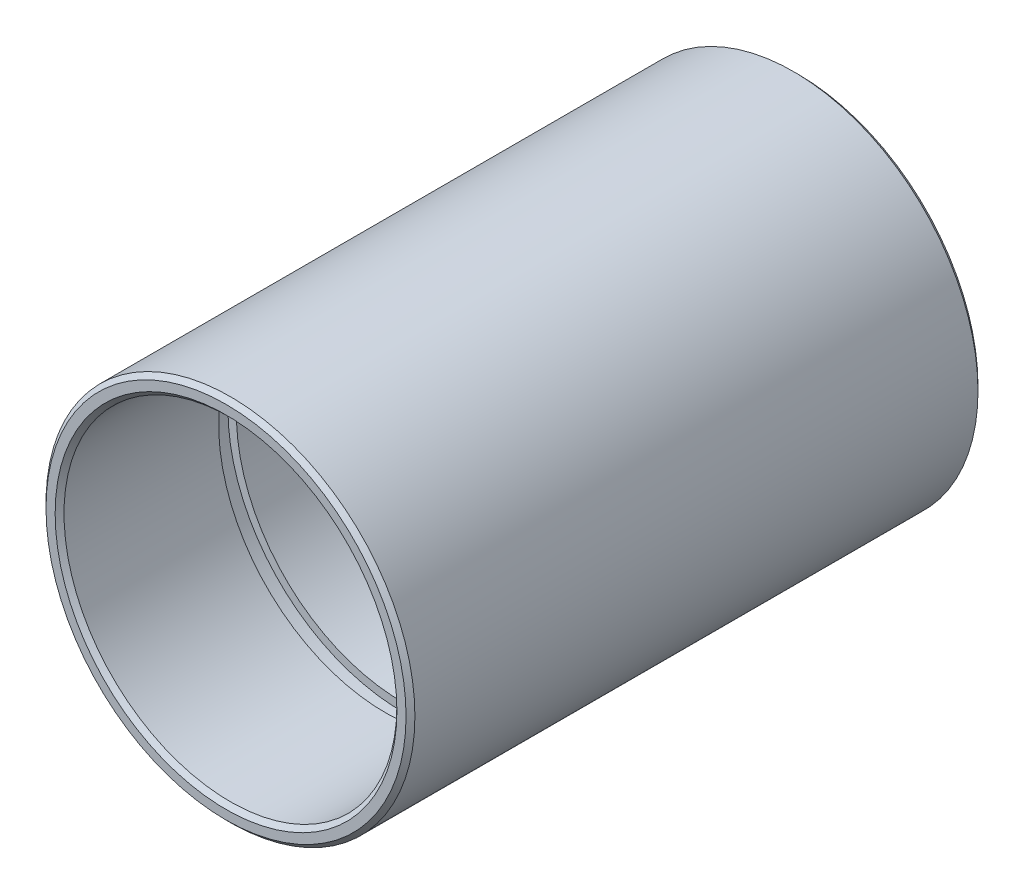
ISO-10303-21;
HEADER;
FILE_DESCRIPTION(('STEP AP214'),'2;1');
FILE_NAME('part.step','',(''),(''),'','','');
FILE_SCHEMA(('AUTOMOTIVE_DESIGN { 1 0 10303 214 1 1 1 1 }'));
ENDSEC;
DATA;
#1=APPLICATION_CONTEXT('core data for automotive mechanical design processes');
#2=APPLICATION_PROTOCOL_DEFINITION('international standard','automotive_design',2000,#1);
#3=PRODUCT_CONTEXT('',#1,'mechanical');
#4=PRODUCT('Part','Part','',(#3));
#5=PRODUCT_RELATED_PRODUCT_CATEGORY('part','',(#4));
#6=PRODUCT_DEFINITION_FORMATION('','',#4);
#7=PRODUCT_DEFINITION_CONTEXT('part definition',#1,'design');
#8=PRODUCT_DEFINITION('design','',#6,#7);
#9=PRODUCT_DEFINITION_SHAPE('','',#8);
#10=(LENGTH_UNIT() NAMED_UNIT(*) SI_UNIT(.MILLI.,.METRE.));
#11=(NAMED_UNIT(*) PLANE_ANGLE_UNIT() SI_UNIT($,.RADIAN.));
#12=(NAMED_UNIT(*) SI_UNIT($,.STERADIAN.) SOLID_ANGLE_UNIT());
#13=UNCERTAINTY_MEASURE_WITH_UNIT(LENGTH_MEASURE(1.E-05),#10,'distance_accuracy_value','');
#14=(GEOMETRIC_REPRESENTATION_CONTEXT(3) GLOBAL_UNCERTAINTY_ASSIGNED_CONTEXT((#13)) GLOBAL_UNIT_ASSIGNED_CONTEXT((#10,
#11,#12)) REPRESENTATION_CONTEXT('',''));
#15=CARTESIAN_POINT('',(0.,0.,0.));
#16=DIRECTION('',(0.,0.,1.));
#17=DIRECTION('',(1.,0.,0.));
#18=AXIS2_PLACEMENT_3D('',#15,#16,#17);
#19=CARTESIAN_POINT('',(0.,0.,49.2252));
#20=DIRECTION('',(0.,0.,-1.));
#21=DIRECTION('',(-1.,0.,0.));
#22=AXIS2_PLACEMENT_3D('',#19,#20,#21);
#23=CYLINDRICAL_SURFACE('',#22,14.3256);
#24=CARTESIAN_POINT('',(0.,0.,15.2146));
#25=DIRECTION('',(0.,0.,1.));
#26=DIRECTION('',(1.,0.,0.));
#27=AXIS2_PLACEMENT_3D('',#24,#25,#26);
#28=CIRCLE('',#27,14.3256);
#29=CARTESIAN_POINT('',(14.3256,0.,15.2146));
#30=VERTEX_POINT('',#29);
#31=EDGE_CURVE('E47',#30,#30,#28,.T.);
#32=ORIENTED_EDGE('',*,*,#31,.F.);
#33=EDGE_LOOP('',(#32));
#34=FACE_BOUND('',#33,.T.);
#35=CARTESIAN_POINT('',(0.,0.,34.0106));
#36=DIRECTION('',(0.,0.,1.));
#37=DIRECTION('',(1.,0.,0.));
#38=AXIS2_PLACEMENT_3D('',#35,#36,#37);
#39=CIRCLE('',#38,14.3256);
#40=CARTESIAN_POINT('',(14.3256,0.,34.0106));
#41=VERTEX_POINT('',#40);
#42=EDGE_CURVE('E54',#41,#41,#39,.T.);
#43=ORIENTED_EDGE('',*,*,#42,.T.);
#44=EDGE_LOOP('',(#43));
#45=FACE_BOUND('',#44,.T.);
#46=ADVANCED_FACE('F30',(#34,#45),#23,.F.);
#47=CARTESIAN_POINT('',(0.,0.,0.380999999999999));
#48=DIRECTION('',(0.,0.,1.));
#49=DIRECTION('',(1.,0.,0.));
#50=AXIS2_PLACEMENT_3D('',#47,#48,#49);
#51=CIRCLE('',#50,14.3256);
#52=CARTESIAN_POINT('',(14.3256,0.,0.380999999999999));
#53=VERTEX_POINT('',#52);
#54=EDGE_CURVE('E81',#53,#53,#51,.F.);
#55=ORIENTED_EDGE('',*,*,#54,.T.);
#56=EDGE_LOOP('',(#55));
#57=FACE_BOUND('',#56,.T.);
#58=CARTESIAN_POINT('',(0.,0.,13.6906));
#59=DIRECTION('',(0.,0.,1.));
#60=DIRECTION('',(1.,0.,0.));
#61=AXIS2_PLACEMENT_3D('',#58,#59,#60);
#62=CIRCLE('',#61,14.3256);
#63=CARTESIAN_POINT('',(14.3256,0.,13.6906));
#64=VERTEX_POINT('',#63);
#65=EDGE_CURVE('E50',#64,#64,#62,.T.);
#66=ORIENTED_EDGE('',*,*,#65,.T.);
#67=EDGE_LOOP('',(#66));
#68=FACE_BOUND('',#67,.T.);
#69=ADVANCED_FACE('F105',(#57,#68),#23,.F.);
#70=CARTESIAN_POINT('',(0.,0.,49.2252));
#71=DIRECTION('',(0.,0.,1.));
#72=DIRECTION('',(1.,0.,0.));
#73=AXIS2_PLACEMENT_3D('',#70,#71,#72);
#74=PLANE('',#73);
#75=CARTESIAN_POINT('',(0.,0.,49.2252));
#76=DIRECTION('',(0.,0.,1.));
#77=DIRECTION('',(1.,0.,0.));
#78=AXIS2_PLACEMENT_3D('',#75,#76,#77);
#79=CIRCLE('',#78,14.7066);
#80=CARTESIAN_POINT('',(14.7066,0.,49.2252));
#81=VERTEX_POINT('',#80);
#82=EDGE_CURVE('E43',#81,#81,#79,.F.);
#83=ORIENTED_EDGE('',*,*,#82,.T.);
#84=EDGE_LOOP('',(#83));
#85=FACE_BOUND('',#84,.T.);
#86=CARTESIAN_POINT('',(0.,0.,49.2252));
#87=DIRECTION('',(0.,0.,1.));
#88=DIRECTION('',(1.,0.,0.));
#89=AXIS2_PLACEMENT_3D('',#86,#87,#88);
#90=CIRCLE('',#89,15.494);
#91=CARTESIAN_POINT('',(15.494,0.,49.2252));
#92=VERTEX_POINT('',#91);
#93=EDGE_CURVE('E84',#92,#92,#90,.T.);
#94=ORIENTED_EDGE('',*,*,#93,.T.);
#95=EDGE_LOOP('',(#94));
#96=FACE_BOUND('',#95,.T.);
#97=ADVANCED_FACE('F89',(#85,#96),#74,.T.);
#98=CARTESIAN_POINT('',(0.,0.,0.));
#99=DIRECTION('',(0.,0.,1.));
#100=DIRECTION('',(1.,0.,0.));
#101=AXIS2_PLACEMENT_3D('',#98,#99,#100);
#102=PLANE('',#101);
#103=CARTESIAN_POINT('',(0.,0.,0.));
#104=DIRECTION('',(0.,0.,1.));
#105=DIRECTION('',(1.,0.,0.));
#106=AXIS2_PLACEMENT_3D('',#103,#104,#105);
#107=CIRCLE('',#106,14.7066);
#108=CARTESIAN_POINT('',(14.7066,0.,0.));
#109=VERTEX_POINT('',#108);
#110=EDGE_CURVE('E75',#109,#109,#107,.T.);
#111=ORIENTED_EDGE('',*,*,#110,.T.);
#112=EDGE_LOOP('',(#111));
#113=FACE_BOUND('',#112,.T.);
#114=CARTESIAN_POINT('',(0.,0.,0.));
#115=DIRECTION('',(0.,0.,1.));
#116=DIRECTION('',(1.,0.,0.));
#117=AXIS2_PLACEMENT_3D('',#114,#115,#116);
#118=CIRCLE('',#117,15.494);
#119=CARTESIAN_POINT('',(15.494,0.,0.));
#120=VERTEX_POINT('',#119);
#121=EDGE_CURVE('E53',#120,#120,#118,.F.);
#122=ORIENTED_EDGE('',*,*,#121,.T.);
#123=EDGE_LOOP('',(#122));
#124=FACE_BOUND('',#123,.T.);
#125=ADVANCED_FACE('F112',(#113,#124),#102,.F.);
#126=CARTESIAN_POINT('',(0.,0.,49.2252));
#127=DIRECTION('',(0.,0.,-1.));
#128=DIRECTION('',(-1.,0.,0.));
#129=AXIS2_PLACEMENT_3D('',#126,#127,#128);
#130=CYLINDRICAL_SURFACE('',#129,15.875);
#131=CARTESIAN_POINT('',(0.,0.,0.380999999999999));
#132=DIRECTION('',(0.,0.,1.));
#133=DIRECTION('',(1.,0.,0.));
#134=AXIS2_PLACEMENT_3D('',#131,#132,#133);
#135=CIRCLE('',#134,15.875);
#136=CARTESIAN_POINT('',(15.875,0.,0.380999999999999));
#137=VERTEX_POINT('',#136);
#138=EDGE_CURVE('E10',#137,#137,#135,.T.);
#139=ORIENTED_EDGE('',*,*,#138,.T.);
#140=EDGE_LOOP('',(#139));
#141=FACE_BOUND('',#140,.T.);
#142=CARTESIAN_POINT('',(0.,0.,48.8442));
#143=DIRECTION('',(0.,0.,1.));
#144=DIRECTION('',(1.,0.,0.));
#145=AXIS2_PLACEMENT_3D('',#142,#143,#144);
#146=CIRCLE('',#145,15.875);
#147=CARTESIAN_POINT('',(15.875,0.,48.8442));
#148=VERTEX_POINT('',#147);
#149=EDGE_CURVE('E38',#148,#148,#146,.F.);
#150=ORIENTED_EDGE('',*,*,#149,.T.);
#151=EDGE_LOOP('',(#150));
#152=FACE_BOUND('',#151,.T.);
#153=ADVANCED_FACE('F102',(#141,#152),#130,.T.);
#154=CARTESIAN_POINT('',(0.,0.,35.5346));
#155=DIRECTION('',(0.,0.,1.));
#156=DIRECTION('',(1.,0.,0.));
#157=AXIS2_PLACEMENT_3D('',#154,#155,#156);
#158=CIRCLE('',#157,14.3256);
#159=CARTESIAN_POINT('',(14.3256,0.,35.5346));
#160=VERTEX_POINT('',#159);
#161=EDGE_CURVE('E34',#160,#160,#158,.T.);
#162=ORIENTED_EDGE('',*,*,#161,.F.);
#163=EDGE_LOOP('',(#162));
#164=FACE_BOUND('',#163,.T.);
#165=CARTESIAN_POINT('',(0.,0.,48.8442));
#166=DIRECTION('',(0.,0.,1.));
#167=DIRECTION('',(1.,0.,0.));
#168=AXIS2_PLACEMENT_3D('',#165,#166,#167);
#169=CIRCLE('',#168,14.3256);
#170=CARTESIAN_POINT('',(14.3256,0.,48.8442));
#171=VERTEX_POINT('',#170);
#172=EDGE_CURVE('E78',#171,#171,#169,.T.);
#173=ORIENTED_EDGE('',*,*,#172,.T.);
#174=EDGE_LOOP('',(#173));
#175=FACE_BOUND('',#174,.T.);
#176=ADVANCED_FACE('F100',(#164,#175),#23,.F.);
#177=CARTESIAN_POINT('',(0.,0.,0.));
#178=DIRECTION('',(0.,0.,-1.));
#179=DIRECTION('',(-1.,0.,0.));
#180=AXIS2_PLACEMENT_3D('',#177,#178,#179);
#181=CONICAL_SURFACE('',#180,14.7066,0.785398163397457);
#182=ORIENTED_EDGE('',*,*,#54,.F.);
#183=EDGE_LOOP('',(#182));
#184=FACE_BOUND('',#183,.T.);
#185=ORIENTED_EDGE('',*,*,#110,.F.);
#186=EDGE_LOOP('',(#185));
#187=FACE_BOUND('',#186,.T.);
#188=ADVANCED_FACE('F96',(#184,#187),#181,.F.);
#189=CARTESIAN_POINT('',(0.,0.,48.8442));
#190=DIRECTION('',(0.,0.,1.));
#191=DIRECTION('',(1.,0.,0.));
#192=AXIS2_PLACEMENT_3D('',#189,#190,#191);
#193=CONICAL_SURFACE('',#192,14.3256,0.785398163397457);
#194=ORIENTED_EDGE('',*,*,#82,.F.);
#195=EDGE_LOOP('',(#194));
#196=FACE_BOUND('',#195,.T.);
#197=ORIENTED_EDGE('',*,*,#172,.F.);
#198=EDGE_LOOP('',(#197));
#199=FACE_BOUND('',#198,.T.);
#200=ADVANCED_FACE('F92',(#196,#199),#193,.F.);
#201=CARTESIAN_POINT('',(0.,0.,0.380999999999999));
#202=DIRECTION('',(0.,0.,1.));
#203=DIRECTION('',(1.,0.,0.));
#204=AXIS2_PLACEMENT_3D('',#201,#202,#203);
#205=CONICAL_SURFACE('',#204,15.875,0.785398163397457);
#206=ORIENTED_EDGE('',*,*,#121,.F.);
#207=EDGE_LOOP('',(#206));
#208=FACE_BOUND('',#207,.T.);
#209=ORIENTED_EDGE('',*,*,#138,.F.);
#210=EDGE_LOOP('',(#209));
#211=FACE_BOUND('',#210,.T.);
#212=ADVANCED_FACE('F95',(#208,#211),#205,.T.);
#213=CARTESIAN_POINT('',(0.,0.,49.2252));
#214=DIRECTION('',(0.,0.,-1.));
#215=DIRECTION('',(-1.,0.,0.));
#216=AXIS2_PLACEMENT_3D('',#213,#214,#215);
#217=CONICAL_SURFACE('',#216,15.494,0.785398163397457);
#218=ORIENTED_EDGE('',*,*,#149,.F.);
#219=EDGE_LOOP('',(#218));
#220=FACE_BOUND('',#219,.T.);
#221=ORIENTED_EDGE('',*,*,#93,.F.);
#222=EDGE_LOOP('',(#221));
#223=FACE_BOUND('',#222,.T.);
#224=ADVANCED_FACE('F32',(#220,#223),#217,.T.);
#225=CARTESIAN_POINT('',(0.,0.,13.6906));
#226=DIRECTION('',(0.,0.,1.));
#227=DIRECTION('',(1.,0.,0.));
#228=AXIS2_PLACEMENT_3D('',#225,#226,#227);
#229=CYLINDRICAL_SURFACE('',#228,15.0495);
#230=CARTESIAN_POINT('',(0.,0.,13.6906));
#231=DIRECTION('',(0.,0.,1.));
#232=DIRECTION('',(1.,0.,0.));
#233=AXIS2_PLACEMENT_3D('',#230,#231,#232);
#234=CIRCLE('',#233,15.0495);
#235=CARTESIAN_POINT('',(15.0495,0.,13.6906));
#236=VERTEX_POINT('',#235);
#237=EDGE_CURVE('E51',#236,#236,#234,.T.);
#238=CARTESIAN_POINT('',(0.,0.,15.2146));
#239=DIRECTION('',(0.,0.,1.));
#240=DIRECTION('',(1.,0.,0.));
#241=AXIS2_PLACEMENT_3D('',#238,#239,#240);
#242=CIRCLE('',#241,15.0495);
#243=CARTESIAN_POINT('',(15.0495,0.,15.2146));
#244=VERTEX_POINT('',#243);
#245=EDGE_CURVE('E60',#244,#244,#242,.T.);
#246=CARTESIAN_POINT('',(15.0495,0.,13.6906));
#247=CARTESIAN_POINT('',(15.0495,0.,13.706475));
#248=CARTESIAN_POINT('',(15.0495,0.,13.72235));
#249=CARTESIAN_POINT('',(15.0495,0.,13.7541));
#250=CARTESIAN_POINT('',(15.0495,0.,13.769975));
#251=CARTESIAN_POINT('',(15.0495,0.,13.801725));
#252=CARTESIAN_POINT('',(15.0495,0.,13.8176));
#253=CARTESIAN_POINT('',(15.0495,0.,13.84935));
#254=CARTESIAN_POINT('',(15.0495,0.,13.865225));
#255=CARTESIAN_POINT('',(15.0495,0.,13.896975));
#256=CARTESIAN_POINT('',(15.0495,0.,13.91285));
#257=CARTESIAN_POINT('',(15.0495,0.,13.9446));
#258=CARTESIAN_POINT('',(15.0495,0.,13.960475));
#259=CARTESIAN_POINT('',(15.0495,0.,13.992225));
#260=CARTESIAN_POINT('',(15.0495,0.,14.0081));
#261=CARTESIAN_POINT('',(15.0495,0.,14.03985));
#262=CARTESIAN_POINT('',(15.0495,0.,14.055725));
#263=CARTESIAN_POINT('',(15.0495,0.,14.087475));
#264=CARTESIAN_POINT('',(15.0495,0.,14.10335));
#265=CARTESIAN_POINT('',(15.0495,0.,14.1351));
#266=CARTESIAN_POINT('',(15.0495,0.,14.150975));
#267=CARTESIAN_POINT('',(15.0495,0.,14.182725));
#268=CARTESIAN_POINT('',(15.0495,0.,14.1986));
#269=CARTESIAN_POINT('',(15.0495,0.,14.23035));
#270=CARTESIAN_POINT('',(15.0495,0.,14.246225));
#271=CARTESIAN_POINT('',(15.0495,0.,14.277975));
#272=CARTESIAN_POINT('',(15.0495,0.,14.29385));
#273=CARTESIAN_POINT('',(15.0495,0.,14.3256));
#274=CARTESIAN_POINT('',(15.0495,0.,14.341475));
#275=CARTESIAN_POINT('',(15.0495,0.,14.373225));
#276=CARTESIAN_POINT('',(15.0495,0.,14.3891));
#277=CARTESIAN_POINT('',(15.0495,0.,14.42085));
#278=CARTESIAN_POINT('',(15.0495,0.,14.436725));
#279=CARTESIAN_POINT('',(15.0495,0.,14.468475));
#280=CARTESIAN_POINT('',(15.0495,0.,14.48435));
#281=CARTESIAN_POINT('',(15.0495,0.,14.5161));
#282=CARTESIAN_POINT('',(15.0495,0.,14.531975));
#283=CARTESIAN_POINT('',(15.0495,0.,14.563725));
#284=CARTESIAN_POINT('',(15.0495,0.,14.5796));
#285=CARTESIAN_POINT('',(15.0495,0.,14.61135));
#286=CARTESIAN_POINT('',(15.0495,0.,14.627225));
#287=CARTESIAN_POINT('',(15.0495,0.,14.658975));
#288=CARTESIAN_POINT('',(15.0495,0.,14.67485));
#289=CARTESIAN_POINT('',(15.0495,0.,14.7066));
#290=CARTESIAN_POINT('',(15.0495,0.,14.722475));
#291=CARTESIAN_POINT('',(15.0495,0.,14.754225));
#292=CARTESIAN_POINT('',(15.0495,0.,14.7701));
#293=CARTESIAN_POINT('',(15.0495,0.,14.80185));
#294=CARTESIAN_POINT('',(15.0495,0.,14.817725));
#295=CARTESIAN_POINT('',(15.0495,0.,14.849475));
#296=CARTESIAN_POINT('',(15.0495,0.,14.86535));
#297=CARTESIAN_POINT('',(15.0495,0.,14.8971));
#298=CARTESIAN_POINT('',(15.0495,0.,14.912975));
#299=CARTESIAN_POINT('',(15.0495,0.,14.944725));
#300=CARTESIAN_POINT('',(15.0495,0.,14.9606));
#301=CARTESIAN_POINT('',(15.0495,0.,14.99235));
#302=CARTESIAN_POINT('',(15.0495,0.,15.008225));
#303=CARTESIAN_POINT('',(15.0495,0.,15.039975));
#304=CARTESIAN_POINT('',(15.0495,0.,15.05585));
#305=CARTESIAN_POINT('',(15.0495,0.,15.0876));
#306=CARTESIAN_POINT('',(15.0495,0.,15.103475));
#307=CARTESIAN_POINT('',(15.0495,0.,15.135225));
#308=CARTESIAN_POINT('',(15.0495,0.,15.1511));
#309=CARTESIAN_POINT('',(15.0495,0.,15.18285));
#310=CARTESIAN_POINT('',(15.0495,0.,15.198725));
#311=CARTESIAN_POINT('',(15.0495,0.,15.2146));
#312=B_SPLINE_CURVE_WITH_KNOTS('',3,(#246,#247,#248,#249,#250,#251,#252,#253,#254,#255,#256,
#257,#258,#259,#260,#261,#262,#263,#264,#265,#266,#267,#268,#269,#270,#271,#272,#273,#274,#275,
#276,#277,#278,#279,#280,#281,#282,#283,#284,#285,#286,#287,#288,#289,#290,#291,#292,#293,#294,
#295,#296,#297,#298,#299,#300,#301,#302,#303,#304,#305,#306,#307,#308,#309,#310,#311),
.UNSPECIFIED.,.F.,.F.,(4,2,2,2,2,2,2,2,2,2,2,2,2,2,2,2,2,2,2,2,2,2,2,2,2,2,2,2,2,2,2,2,4),(0.,
0.0476250000000008,0.0952500000000016,0.142875000000001,0.190500000000001,0.238125,
0.285750000000001,0.333375,0.381000000000001,0.428625,0.476250000000001,0.523875,
0.571500000000001,0.619125,0.666750000000001,0.714375,0.762000000000001,0.809625,0.85725,
0.904875000000001,0.9525,1.000125,1.04775,1.095375,1.143,1.190625,1.23825,1.285875,1.3335,
1.381125,1.42875,1.476375,1.524),.UNSPECIFIED.);
#313=EDGE_CURVE('BSEAM132',#236,#244,#312,.T.);
#314=ORIENTED_EDGE('',*,*,#237,.F.);
#315=ORIENTED_EDGE('',*,*,#245,.T.);
#316=ORIENTED_EDGE('',*,*,#313,.T.);
#317=ORIENTED_EDGE('',*,*,#313,.F.);
#318=EDGE_LOOP('',(#314,#316,#315,#317));
#319=FACE_BOUND('',#318,.T.);
#320=ADVANCED_FACE('F132',(#319),#229,.F.);
#321=CARTESIAN_POINT('',(0.,0.,13.6906));
#322=DIRECTION('',(0.,0.,1.));
#323=DIRECTION('',(1.,0.,0.));
#324=AXIS2_PLACEMENT_3D('',#321,#322,#323);
#325=PLANE('',#324);
#326=ORIENTED_EDGE('',*,*,#65,.F.);
#327=EDGE_LOOP('',(#326));
#328=FACE_BOUND('',#327,.T.);
#329=ORIENTED_EDGE('',*,*,#237,.T.);
#330=EDGE_LOOP('',(#329));
#331=FACE_BOUND('',#330,.T.);
#332=ADVANCED_FACE('F128',(#328,#331),#325,.T.);
#333=CARTESIAN_POINT('',(0.,0.,15.2146));
#334=DIRECTION('',(0.,0.,1.));
#335=DIRECTION('',(1.,0.,0.));
#336=AXIS2_PLACEMENT_3D('',#333,#334,#335);
#337=PLANE('',#336);
#338=ORIENTED_EDGE('',*,*,#31,.T.);
#339=EDGE_LOOP('',(#338));
#340=FACE_BOUND('',#339,.T.);
#341=ORIENTED_EDGE('',*,*,#245,.F.);
#342=EDGE_LOOP('',(#341));
#343=FACE_BOUND('',#342,.T.);
#344=ADVANCED_FACE('F131',(#340,#343),#337,.F.);
#345=CARTESIAN_POINT('',(0.,0.,35.5346));
#346=DIRECTION('',(0.,0.,-1.));
#347=DIRECTION('',(-1.,0.,0.));
#348=AXIS2_PLACEMENT_3D('',#345,#346,#347);
#349=CYLINDRICAL_SURFACE('',#348,15.0495);
#350=CARTESIAN_POINT('',(0.,0.,35.5346));
#351=DIRECTION('',(0.,0.,1.));
#352=DIRECTION('',(1.,0.,0.));
#353=AXIS2_PLACEMENT_3D('',#350,#351,#352);
#354=CIRCLE('',#353,15.0495);
#355=CARTESIAN_POINT('',(-15.0495,0.,35.5346));
#356=VERTEX_POINT('',#355);
#357=EDGE_CURVE('E56',#356,#356,#354,.T.);
#358=CARTESIAN_POINT('',(0.,0.,34.0106));
#359=DIRECTION('',(0.,0.,1.));
#360=DIRECTION('',(1.,0.,0.));
#361=AXIS2_PLACEMENT_3D('',#358,#359,#360);
#362=CIRCLE('',#361,15.0495);
#363=CARTESIAN_POINT('',(-15.0495,0.,34.0106));
#364=VERTEX_POINT('',#363);
#365=EDGE_CURVE('E62',#364,#364,#362,.T.);
#366=CARTESIAN_POINT('',(-15.0495,0.,35.5346));
#367=CARTESIAN_POINT('',(-15.0495,0.,35.518725));
#368=CARTESIAN_POINT('',(-15.0495,0.,35.50285));
#369=CARTESIAN_POINT('',(-15.0495,0.,35.4711));
#370=CARTESIAN_POINT('',(-15.0495,0.,35.455225));
#371=CARTESIAN_POINT('',(-15.0495,0.,35.423475));
#372=CARTESIAN_POINT('',(-15.0495,0.,35.4076));
#373=CARTESIAN_POINT('',(-15.0495,0.,35.37585));
#374=CARTESIAN_POINT('',(-15.0495,0.,35.359975));
#375=CARTESIAN_POINT('',(-15.0495,0.,35.328225));
#376=CARTESIAN_POINT('',(-15.0495,0.,35.31235));
#377=CARTESIAN_POINT('',(-15.0495,0.,35.2806));
#378=CARTESIAN_POINT('',(-15.0495,0.,35.264725));
#379=CARTESIAN_POINT('',(-15.0495,0.,35.232975));
#380=CARTESIAN_POINT('',(-15.0495,0.,35.2171));
#381=CARTESIAN_POINT('',(-15.0495,0.,35.18535));
#382=CARTESIAN_POINT('',(-15.0495,0.,35.169475));
#383=CARTESIAN_POINT('',(-15.0495,0.,35.137725));
#384=CARTESIAN_POINT('',(-15.0495,0.,35.12185));
#385=CARTESIAN_POINT('',(-15.0495,0.,35.0901));
#386=CARTESIAN_POINT('',(-15.0495,0.,35.074225));
#387=CARTESIAN_POINT('',(-15.0495,0.,35.042475));
#388=CARTESIAN_POINT('',(-15.0495,0.,35.0266));
#389=CARTESIAN_POINT('',(-15.0495,0.,34.99485));
#390=CARTESIAN_POINT('',(-15.0495,0.,34.978975));
#391=CARTESIAN_POINT('',(-15.0495,0.,34.947225));
#392=CARTESIAN_POINT('',(-15.0495,0.,34.93135));
#393=CARTESIAN_POINT('',(-15.0495,0.,34.8996));
#394=CARTESIAN_POINT('',(-15.0495,0.,34.883725));
#395=CARTESIAN_POINT('',(-15.0495,0.,34.851975));
#396=CARTESIAN_POINT('',(-15.0495,0.,34.8361));
#397=CARTESIAN_POINT('',(-15.0495,0.,34.80435));
#398=CARTESIAN_POINT('',(-15.0495,0.,34.788475));
#399=CARTESIAN_POINT('',(-15.0495,0.,34.756725));
#400=CARTESIAN_POINT('',(-15.0495,0.,34.74085));
#401=CARTESIAN_POINT('',(-15.0495,0.,34.7091));
#402=CARTESIAN_POINT('',(-15.0495,0.,34.693225));
#403=CARTESIAN_POINT('',(-15.0495,0.,34.661475));
#404=CARTESIAN_POINT('',(-15.0495,0.,34.6456));
#405=CARTESIAN_POINT('',(-15.0495,0.,34.61385));
#406=CARTESIAN_POINT('',(-15.0495,0.,34.597975));
#407=CARTESIAN_POINT('',(-15.0495,0.,34.566225));
#408=CARTESIAN_POINT('',(-15.0495,0.,34.55035));
#409=CARTESIAN_POINT('',(-15.0495,0.,34.5186));
#410=CARTESIAN_POINT('',(-15.0495,0.,34.502725));
#411=CARTESIAN_POINT('',(-15.0495,0.,34.470975));
#412=CARTESIAN_POINT('',(-15.0495,0.,34.4551));
#413=CARTESIAN_POINT('',(-15.0495,0.,34.42335));
#414=CARTESIAN_POINT('',(-15.0495,0.,34.407475));
#415=CARTESIAN_POINT('',(-15.0495,0.,34.375725));
#416=CARTESIAN_POINT('',(-15.0495,0.,34.35985));
#417=CARTESIAN_POINT('',(-15.0495,0.,34.3281));
#418=CARTESIAN_POINT('',(-15.0495,0.,34.312225));
#419=CARTESIAN_POINT('',(-15.0495,0.,34.280475));
#420=CARTESIAN_POINT('',(-15.0495,0.,34.2646));
#421=CARTESIAN_POINT('',(-15.0495,0.,34.23285));
#422=CARTESIAN_POINT('',(-15.0495,0.,34.216975));
#423=CARTESIAN_POINT('',(-15.0495,0.,34.185225));
#424=CARTESIAN_POINT('',(-15.0495,0.,34.16935));
#425=CARTESIAN_POINT('',(-15.0495,0.,34.1376));
#426=CARTESIAN_POINT('',(-15.0495,0.,34.121725));
#427=CARTESIAN_POINT('',(-15.0495,0.,34.089975));
#428=CARTESIAN_POINT('',(-15.0495,0.,34.0741));
#429=CARTESIAN_POINT('',(-15.0495,0.,34.04235));
#430=CARTESIAN_POINT('',(-15.0495,0.,34.026475));
#431=CARTESIAN_POINT('',(-15.0495,0.,34.0106));
#432=B_SPLINE_CURVE_WITH_KNOTS('',3,(#366,#367,#368,#369,#370,#371,#372,#373,#374,#375,#376,
#377,#378,#379,#380,#381,#382,#383,#384,#385,#386,#387,#388,#389,#390,#391,#392,#393,#394,#395,
#396,#397,#398,#399,#400,#401,#402,#403,#404,#405,#406,#407,#408,#409,#410,#411,#412,#413,#414,
#415,#416,#417,#418,#419,#420,#421,#422,#423,#424,#425,#426,#427,#428,#429,#430,#431),
.UNSPECIFIED.,.F.,.F.,(4,2,2,2,2,2,2,2,2,2,2,2,2,2,2,2,2,2,2,2,2,2,2,2,2,2,2,2,2,2,2,2,4),(0.,
0.0476249999999956,0.0952499999999981,0.142874999999994,0.190499999999996,0.238124999999999,
0.285749999999994,0.333374999999997,0.380999999999999,0.428624999999995,0.476249999999998,
0.523874999999993,0.571499999999996,0.619124999999998,0.666749999999994,0.714374999999996,
0.761999999999999,0.809624999999994,0.857249999999997,0.904874999999993,0.952499999999995,
1.000125,1.04774999999999,1.095375,1.143,1.19062499999999,1.23825,1.28587499999999,
1.33349999999999,1.381125,1.42874999999999,1.476375,1.524),.UNSPECIFIED.);
#433=EDGE_CURVE('BSEAM141',#356,#364,#432,.T.);
#434=ORIENTED_EDGE('',*,*,#357,.T.);
#435=ORIENTED_EDGE('',*,*,#365,.F.);
#436=ORIENTED_EDGE('',*,*,#433,.T.);
#437=ORIENTED_EDGE('',*,*,#433,.F.);
#438=EDGE_LOOP('',(#434,#436,#435,#437));
#439=FACE_BOUND('',#438,.T.);
#440=ADVANCED_FACE('F141',(#439),#349,.F.);
#441=CARTESIAN_POINT('',(0.,0.,35.5346));
#442=DIRECTION('',(0.,0.,1.));
#443=DIRECTION('',(1.,0.,0.));
#444=AXIS2_PLACEMENT_3D('',#441,#442,#443);
#445=PLANE('',#444);
#446=ORIENTED_EDGE('',*,*,#161,.T.);
#447=EDGE_LOOP('',(#446));
#448=FACE_BOUND('',#447,.T.);
#449=ORIENTED_EDGE('',*,*,#357,.F.);
#450=EDGE_LOOP('',(#449));
#451=FACE_BOUND('',#450,.T.);
#452=ADVANCED_FACE('F147',(#448,#451),#445,.F.);
#453=CARTESIAN_POINT('',(0.,0.,34.0106));
#454=DIRECTION('',(0.,0.,1.));
#455=DIRECTION('',(1.,0.,0.));
#456=AXIS2_PLACEMENT_3D('',#453,#454,#455);
#457=PLANE('',#456);
#458=ORIENTED_EDGE('',*,*,#42,.F.);
#459=EDGE_LOOP('',(#458));
#460=FACE_BOUND('',#459,.T.);
#461=ORIENTED_EDGE('',*,*,#365,.T.);
#462=EDGE_LOOP('',(#461));
#463=FACE_BOUND('',#462,.T.);
#464=ADVANCED_FACE('F150',(#460,#463),#457,.T.);
#465=CLOSED_SHELL('',(#46,#69,#97,#125,#153,#176,#188,#200,#212,#224,#320,#332,#344,#440,#452,#464));
#466=MANIFOLD_SOLID_BREP('B2',#465);
#467=ADVANCED_BREP_SHAPE_REPRESENTATION('',(#18,#466),#14);
#468=SHAPE_DEFINITION_REPRESENTATION(#9,#467);
ENDSEC;
END-ISO-10303-21;
